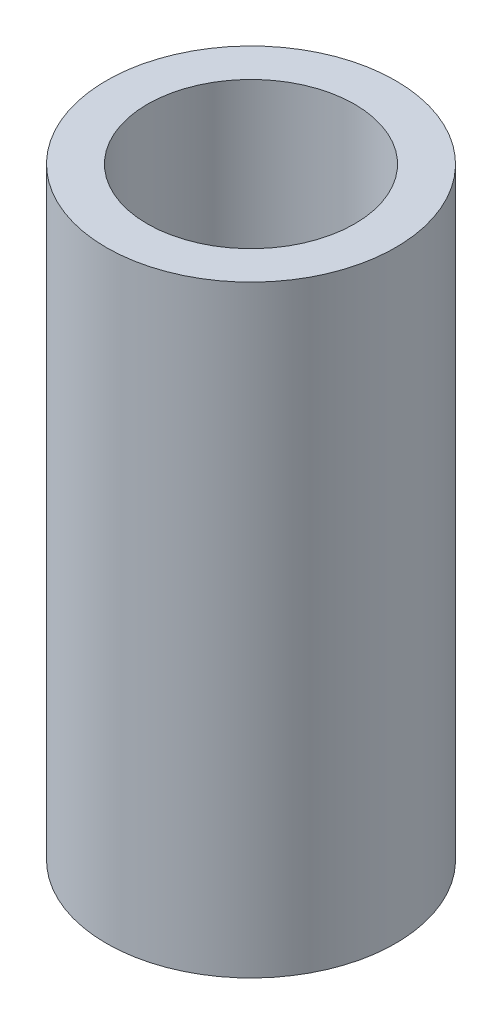
ISO-10303-21;
HEADER;
FILE_DESCRIPTION(('STEP AP214'),'2;1');
FILE_NAME('part.step','',(''),(''),'','','');
FILE_SCHEMA(('AUTOMOTIVE_DESIGN { 1 0 10303 214 1 1 1 1 }'));
ENDSEC;
DATA;
#1=APPLICATION_CONTEXT('core data for automotive mechanical design processes');
#2=APPLICATION_PROTOCOL_DEFINITION('international standard','automotive_design',2000,#1);
#3=PRODUCT_CONTEXT('',#1,'mechanical');
#4=PRODUCT('Part','Part','',(#3));
#5=PRODUCT_RELATED_PRODUCT_CATEGORY('part','',(#4));
#6=PRODUCT_DEFINITION_FORMATION('','',#4);
#7=PRODUCT_DEFINITION_CONTEXT('part definition',#1,'design');
#8=PRODUCT_DEFINITION('design','',#6,#7);
#9=PRODUCT_DEFINITION_SHAPE('','',#8);
#10=(LENGTH_UNIT() NAMED_UNIT(*) SI_UNIT(.MILLI.,.METRE.));
#11=(NAMED_UNIT(*) PLANE_ANGLE_UNIT() SI_UNIT($,.RADIAN.));
#12=(NAMED_UNIT(*) SI_UNIT($,.STERADIAN.) SOLID_ANGLE_UNIT());
#13=UNCERTAINTY_MEASURE_WITH_UNIT(LENGTH_MEASURE(1.E-05),#10,'distance_accuracy_value','');
#14=(GEOMETRIC_REPRESENTATION_CONTEXT(3) GLOBAL_UNCERTAINTY_ASSIGNED_CONTEXT((#13)) GLOBAL_UNIT_ASSIGNED_CONTEXT((#10,
#11,#12)) REPRESENTATION_CONTEXT('',''));
#15=CARTESIAN_POINT('',(0.,0.,0.));
#16=DIRECTION('',(0.,0.,1.));
#17=DIRECTION('',(1.,0.,0.));
#18=AXIS2_PLACEMENT_3D('',#15,#16,#17);
#19=CARTESIAN_POINT('',(0.,25.,0.));
#20=DIRECTION('',(0.,1.,0.));
#21=DIRECTION('',(0.,0.,1.));
#22=AXIS2_PLACEMENT_3D('',#19,#20,#21);
#23=PLANE('',#22);
#24=CARTESIAN_POINT('',(0.,25.,0.));
#25=DIRECTION('',(0.,1.,0.));
#26=DIRECTION('',(0.,0.,1.));
#27=AXIS2_PLACEMENT_3D('',#24,#25,#26);
#28=CIRCLE('',#27,6.);
#29=CARTESIAN_POINT('',(0.,25.,6.));
#30=VERTEX_POINT('',#29);
#31=EDGE_CURVE('E10',#30,#30,#28,.T.);
#32=ORIENTED_EDGE('',*,*,#31,.T.);
#33=EDGE_LOOP('',(#32));
#34=FACE_BOUND('',#33,.T.);
#35=CARTESIAN_POINT('',(0.,25.,0.));
#36=DIRECTION('',(0.,1.,0.));
#37=DIRECTION('',(0.,0.,1.));
#38=AXIS2_PLACEMENT_3D('',#35,#36,#37);
#39=CIRCLE('',#38,4.3);
#40=CARTESIAN_POINT('',(0.,25.,4.3));
#41=VERTEX_POINT('',#40);
#42=EDGE_CURVE('E44',#41,#41,#39,.T.);
#43=ORIENTED_EDGE('',*,*,#42,.F.);
#44=EDGE_LOOP('',(#43));
#45=FACE_BOUND('',#44,.T.);
#46=ADVANCED_FACE('F33',(#34,#45),#23,.T.);
#47=CARTESIAN_POINT('',(0.,0.,0.));
#48=DIRECTION('',(0.,1.,0.));
#49=DIRECTION('',(0.,0.,1.));
#50=AXIS2_PLACEMENT_3D('',#47,#48,#49);
#51=PLANE('',#50);
#52=CARTESIAN_POINT('',(0.,0.,0.));
#53=DIRECTION('',(0.,1.,0.));
#54=DIRECTION('',(0.,0.,1.));
#55=AXIS2_PLACEMENT_3D('',#52,#53,#54);
#56=CIRCLE('',#55,6.);
#57=CARTESIAN_POINT('',(0.,0.,6.));
#58=VERTEX_POINT('',#57);
#59=EDGE_CURVE('E37',#58,#58,#56,.T.);
#60=ORIENTED_EDGE('',*,*,#59,.F.);
#61=EDGE_LOOP('',(#60));
#62=FACE_BOUND('',#61,.T.);
#63=CARTESIAN_POINT('',(0.,0.,0.));
#64=DIRECTION('',(0.,1.,0.));
#65=DIRECTION('',(0.,0.,1.));
#66=AXIS2_PLACEMENT_3D('',#63,#64,#65);
#67=CIRCLE('',#66,4.3);
#68=CARTESIAN_POINT('',(0.,0.,4.3));
#69=VERTEX_POINT('',#68);
#70=EDGE_CURVE('E46',#69,#69,#67,.T.);
#71=ORIENTED_EDGE('',*,*,#70,.T.);
#72=EDGE_LOOP('',(#71));
#73=FACE_BOUND('',#72,.T.);
#74=ADVANCED_FACE('F56',(#62,#73),#51,.F.);
#75=CARTESIAN_POINT('',(0.,25.,0.));
#76=DIRECTION('',(0.,-1.,0.));
#77=DIRECTION('',(0.,0.,-1.));
#78=AXIS2_PLACEMENT_3D('',#75,#76,#77);
#79=CYLINDRICAL_SURFACE('',#78,6.);
#80=ORIENTED_EDGE('',*,*,#31,.F.);
#81=EDGE_LOOP('',(#80));
#82=FACE_BOUND('',#81,.T.);
#83=ORIENTED_EDGE('',*,*,#59,.T.);
#84=EDGE_LOOP('',(#83));
#85=FACE_BOUND('',#84,.T.);
#86=ADVANCED_FACE('F35',(#82,#85),#79,.T.);
#87=CARTESIAN_POINT('',(0.,25.,0.));
#88=DIRECTION('',(0.,-1.,0.));
#89=DIRECTION('',(0.,0.,-1.));
#90=AXIS2_PLACEMENT_3D('',#87,#88,#89);
#91=CYLINDRICAL_SURFACE('',#90,4.3);
#92=ORIENTED_EDGE('',*,*,#42,.T.);
#93=EDGE_LOOP('',(#92));
#94=FACE_BOUND('',#93,.T.);
#95=ORIENTED_EDGE('',*,*,#70,.F.);
#96=EDGE_LOOP('',(#95));
#97=FACE_BOUND('',#96,.T.);
#98=ADVANCED_FACE('F52',(#94,#97),#91,.F.);
#99=CLOSED_SHELL('',(#46,#74,#86,#98));
#100=MANIFOLD_SOLID_BREP('B2',#99);
#101=ADVANCED_BREP_SHAPE_REPRESENTATION('',(#18,#100),#14);
#102=SHAPE_DEFINITION_REPRESENTATION(#9,#101);
ENDSEC;
END-ISO-10303-21;
